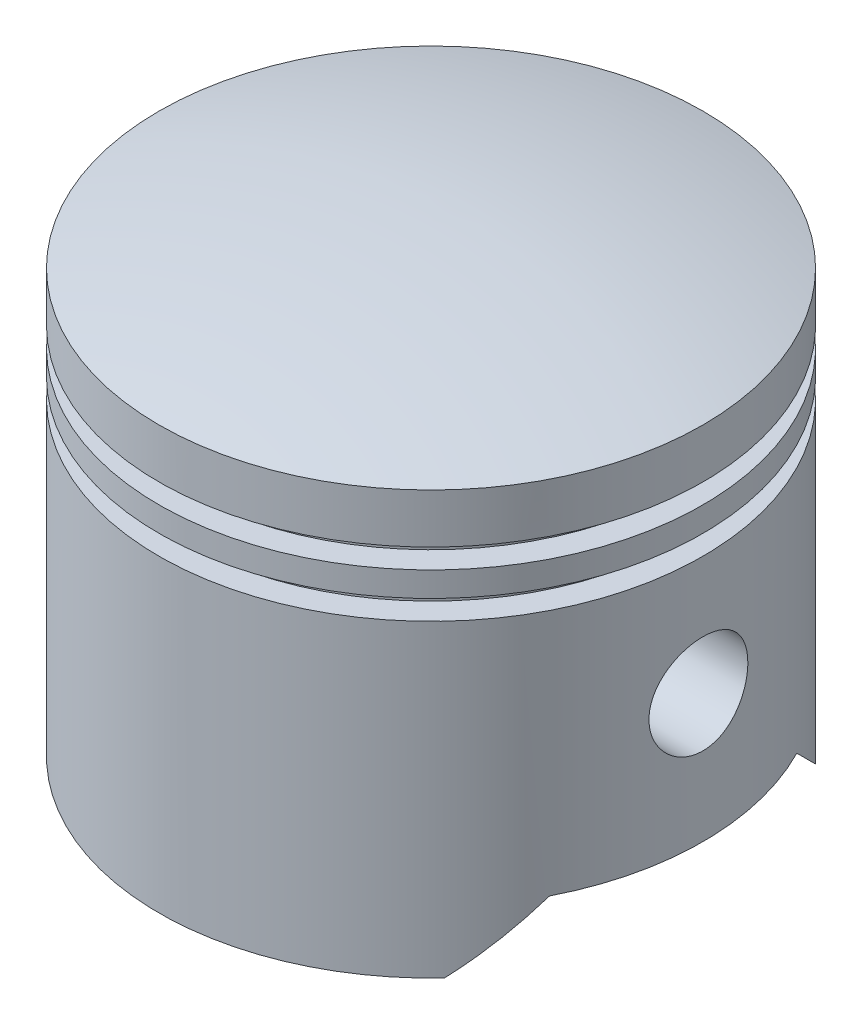
ISO-10303-21;
HEADER;
FILE_DESCRIPTION(('STEP AP214'),'2;1');
FILE_NAME('part.step','',(''),(''),'','','');
FILE_SCHEMA(('AUTOMOTIVE_DESIGN { 1 0 10303 214 1 1 1 1 }'));
ENDSEC;
DATA;
#1=APPLICATION_CONTEXT('core data for automotive mechanical design processes');
#2=APPLICATION_PROTOCOL_DEFINITION('international standard','automotive_design',2000,#1);
#3=PRODUCT_CONTEXT('',#1,'mechanical');
#4=PRODUCT('Part','Part','',(#3));
#5=PRODUCT_RELATED_PRODUCT_CATEGORY('part','',(#4));
#6=PRODUCT_DEFINITION_FORMATION('','',#4);
#7=PRODUCT_DEFINITION_CONTEXT('part definition',#1,'design');
#8=PRODUCT_DEFINITION('design','',#6,#7);
#9=PRODUCT_DEFINITION_SHAPE('','',#8);
#10=(LENGTH_UNIT() NAMED_UNIT(*) SI_UNIT(.MILLI.,.METRE.));
#11=(NAMED_UNIT(*) PLANE_ANGLE_UNIT() SI_UNIT($,.RADIAN.));
#12=(NAMED_UNIT(*) SI_UNIT($,.STERADIAN.) SOLID_ANGLE_UNIT());
#13=UNCERTAINTY_MEASURE_WITH_UNIT(LENGTH_MEASURE(1.E-05),#10,'distance_accuracy_value','');
#14=(GEOMETRIC_REPRESENTATION_CONTEXT(3) GLOBAL_UNCERTAINTY_ASSIGNED_CONTEXT((#13)) GLOBAL_UNIT_ASSIGNED_CONTEXT((#10,
#11,#12)) REPRESENTATION_CONTEXT('',''));
#15=CARTESIAN_POINT('',(0.,0.,0.));
#16=DIRECTION('',(0.,0.,1.));
#17=DIRECTION('',(1.,0.,0.));
#18=AXIS2_PLACEMENT_3D('',#15,#16,#17);
#19=CARTESIAN_POINT('',(-6.,-56.,0.));
#20=DIRECTION('',(1.,0.,0.));
#21=DIRECTION('',(0.,0.,-1.));
#22=AXIS2_PLACEMENT_3D('',#19,#20,#21);
#23=CYLINDRICAL_SURFACE('',#22,75.);
#24=CARTESIAN_POINT('',(6.,-56.,0.));
#25=DIRECTION('',(1.,0.,0.));
#26=DIRECTION('',(0.,0.,-1.));
#27=AXIS2_PLACEMENT_3D('',#24,#25,#26);
#28=CIRCLE('',#27,75.);
#29=CARTESIAN_POINT('',(6.,17.5187051028512,-14.8323969741913));
#30=VERTEX_POINT('',#29);
#31=CARTESIAN_POINT('',(6.,17.5187051028512,14.8323969741913));
#32=VERTEX_POINT('',#31);
#33=EDGE_CURVE('E185',#30,#32,#28,.T.);
#34=ORIENTED_EDGE('',*,*,#33,.T.);
#35=CARTESIAN_POINT('',(6.,17.5187051028512,14.8323969741913));
#36=CARTESIAN_POINT('',(5.75836252367393,17.4989829505454,14.9301433895327));
#37=CARTESIAN_POINT('',(5.51430721440014,17.48025079181,15.0219966371138));
#38=CARTESIAN_POINT('',(5.0218553343729,17.4449367059868,15.1937158110071));
#39=CARTESIAN_POINT('',(4.77345864664999,17.4283548369359,15.2735814137796));
#40=CARTESIAN_POINT('',(4.02268690858528,17.3821019778755,15.4948380198577));
#41=CARTESIAN_POINT('',(3.51456639013813,17.3559101926299,15.6179550759827));
#42=CARTESIAN_POINT('',(2.5073987594542,17.3146857646356,15.8103171965305));
#43=CARTESIAN_POINT('',(2.00871124649219,17.2992761877037,15.8813865039318));
#44=CARTESIAN_POINT('',(1.00668208650338,17.2786641618277,15.9762248796491));
#45=CARTESIAN_POINT('',(0.503341043251691,17.2734604068895,16.));
#46=CARTESIAN_POINT('',(-0.503341043251687,17.2734604068895,16.));
#47=CARTESIAN_POINT('',(-1.00668208650338,17.2786641618277,15.9762248796492));
#48=CARTESIAN_POINT('',(-2.00871124649219,17.2992761877037,15.8813865039318));
#49=CARTESIAN_POINT('',(-2.50739875945419,17.3146857646356,15.8103171965305));
#50=CARTESIAN_POINT('',(-3.51456639013813,17.3559101926299,15.6179550759827));
#51=CARTESIAN_POINT('',(-4.02268690858528,17.3821019778755,15.4948380198577));
#52=CARTESIAN_POINT('',(-4.77345864664999,17.4283548369359,15.2735814137796));
#53=CARTESIAN_POINT('',(-5.0218553343729,17.4449367059868,15.1937158110071));
#54=CARTESIAN_POINT('',(-5.51430721440014,17.4802507918099,15.0219966371138));
#55=CARTESIAN_POINT('',(-5.75836252367393,17.4989829505454,14.9301433895327));
#56=CARTESIAN_POINT('',(-6.,17.5187051028512,14.8323969741913));
#57=B_SPLINE_CURVE_WITH_KNOTS('',3,(#35,#36,#37,#38,#39,#40,#41,#42,#43,#44,#45,#46,#47,#48,#49,
#50,#51,#52,#53,#54,#55,#56),.UNSPECIFIED.,.F.,.F.,(4,2,2,2,2,2,2,2,2,2,4),(0.,0.78404449831372,
1.56811015374929,3.13571220008882,4.64532955159964,6.15475371140588,7.66417787121211,
9.17379522272293,10.7413972690625,11.525462924498,12.3095074228118),.UNSPECIFIED.);
#58=CARTESIAN_POINT('',(-6.,17.5187051028512,14.8323969741913));
#59=VERTEX_POINT('',#58);
#60=EDGE_CURVE('E177',#32,#59,#57,.T.);
#61=ORIENTED_EDGE('',*,*,#60,.T.);
#62=CARTESIAN_POINT('',(-6.,-56.,0.));
#63=DIRECTION('',(1.,0.,0.));
#64=DIRECTION('',(0.,0.,-1.));
#65=AXIS2_PLACEMENT_3D('',#62,#63,#64);
#66=CIRCLE('',#65,75.);
#67=CARTESIAN_POINT('',(-6.,17.5187051028512,-14.8323969741913));
#68=VERTEX_POINT('',#67);
#69=EDGE_CURVE('E184',#68,#59,#66,.T.);
#70=ORIENTED_EDGE('',*,*,#69,.F.);
#71=CARTESIAN_POINT('',(-6.,17.5187051028512,-14.8323969741913));
#72=CARTESIAN_POINT('',(-5.75836252367393,17.4989829505454,-14.9301433895327));
#73=CARTESIAN_POINT('',(-5.51430721440014,17.48025079181,-15.0219966371138));
#74=CARTESIAN_POINT('',(-5.0218553343729,17.4449367059868,-15.1937158110071));
#75=CARTESIAN_POINT('',(-4.77345864664999,17.4283548369359,-15.2735814137796));
#76=CARTESIAN_POINT('',(-4.02268690858528,17.3821019778755,-15.4948380198577));
#77=CARTESIAN_POINT('',(-3.51456639013813,17.3559101926299,-15.6179550759827));
#78=CARTESIAN_POINT('',(-2.50739875945419,17.3146857646356,-15.8103171965305));
#79=CARTESIAN_POINT('',(-2.00871124649219,17.2992761877037,-15.8813865039318));
#80=CARTESIAN_POINT('',(-1.00668208650338,17.2786641618277,-15.9762248796491));
#81=CARTESIAN_POINT('',(-0.503341043251689,17.2734604068895,-16.));
#82=CARTESIAN_POINT('',(0.50334104325169,17.2734604068895,-16.));
#83=CARTESIAN_POINT('',(1.00668208650338,17.2786641618277,-15.9762248796492));
#84=CARTESIAN_POINT('',(2.00871124649219,17.2992761877037,-15.8813865039318));
#85=CARTESIAN_POINT('',(2.50739875945419,17.3146857646356,-15.8103171965305));
#86=CARTESIAN_POINT('',(3.51456639013813,17.3559101926299,-15.6179550759827));
#87=CARTESIAN_POINT('',(4.02268690858528,17.3821019778755,-15.4948380198577));
#88=CARTESIAN_POINT('',(4.77345864664999,17.4283548369359,-15.2735814137796));
#89=CARTESIAN_POINT('',(5.0218553343729,17.4449367059868,-15.1937158110071));
#90=CARTESIAN_POINT('',(5.51430721440014,17.48025079181,-15.0219966371138));
#91=CARTESIAN_POINT('',(5.75836252367393,17.4989829505454,-14.9301433895327));
#92=CARTESIAN_POINT('',(6.,17.5187051028512,-14.8323969741913));
#93=B_SPLINE_CURVE_WITH_KNOTS('',3,(#71,#72,#73,#74,#75,#76,#77,#78,#79,#80,#81,#82,#83,#84,#85,
#86,#87,#88,#89,#90,#91,#92),.UNSPECIFIED.,.F.,.F.,(4,2,2,2,2,2,2,2,2,2,4),(0.,
0.784044498313721,1.56811015374929,3.13571220008882,4.64532955159965,6.15475371140588,
7.66417787121212,9.17379522272294,10.7413972690625,11.525462924498,12.3095074228118),.UNSPECIFIED.);
#94=EDGE_CURVE('E98',#68,#30,#93,.T.);
#95=ORIENTED_EDGE('',*,*,#94,.T.);
#96=EDGE_LOOP('',(#34,#61,#70,#95));
#97=FACE_BOUND('',#96,.T.);
#98=ADVANCED_FACE('F73',(#97),#23,.F.);
#99=CARTESIAN_POINT('',(6.,-56.,0.));
#100=DIRECTION('',(1.,0.,0.));
#101=DIRECTION('',(0.,0.,-1.));
#102=AXIS2_PLACEMENT_3D('',#99,#100,#101);
#103=PLANE('',#102);
#104=CARTESIAN_POINT('',(6.,0.,0.));
#105=DIRECTION('',(1.,0.,0.));
#106=DIRECTION('',(0.,0.,-1.));
#107=AXIS2_PLACEMENT_3D('',#104,#105,#106);
#108=CIRCLE('',#107,4.);
#109=CARTESIAN_POINT('',(6.,0.,-4.));
#110=VERTEX_POINT('',#109);
#111=EDGE_CURVE('E327',#110,#110,#108,.F.);
#112=ORIENTED_EDGE('',*,*,#111,.F.);
#113=EDGE_LOOP('',(#112));
#114=FACE_BOUND('',#113,.T.);
#115=DIRECTION('',(0.,-1.,0.));
#116=VECTOR('',#115,1.);
#117=CARTESIAN_POINT('',(6.,22.001,14.8323969741913));
#118=LINE('',#117,#116);
#119=CARTESIAN_POINT('',(6.,-10.3668522645212,14.8323969741913));
#120=VERTEX_POINT('',#119);
#121=EDGE_CURVE('E172',#32,#120,#118,.T.);
#122=ORIENTED_EDGE('',*,*,#121,.F.);
#123=ORIENTED_EDGE('',*,*,#33,.F.);
#124=DIRECTION('',(0.,-1.,0.));
#125=VECTOR('',#124,1.);
#126=CARTESIAN_POINT('',(6.,22.001,-14.8323969741913));
#127=LINE('',#126,#125);
#128=CARTESIAN_POINT('',(6.,-10.3668522645212,-14.8323969741913));
#129=VERTEX_POINT('',#128);
#130=EDGE_CURVE('E182',#30,#129,#127,.T.);
#131=ORIENTED_EDGE('',*,*,#130,.T.);
#132=DIRECTION('',(0.,0.,-1.));
#133=VECTOR('',#132,1.);
#134=CARTESIAN_POINT('',(6.,-10.3668522645212,16.));
#135=LINE('',#134,#133);
#136=EDGE_CURVE('E90',#120,#129,#135,.T.);
#137=ORIENTED_EDGE('',*,*,#136,.F.);
#138=EDGE_LOOP('',(#122,#123,#131,#137));
#139=FACE_BOUND('',#138,.T.);
#140=ADVANCED_FACE('F180',(#114,#139),#103,.F.);
#141=CARTESIAN_POINT('',(-6.,-56.,0.));
#142=DIRECTION('',(1.,0.,0.));
#143=DIRECTION('',(0.,0.,-1.));
#144=AXIS2_PLACEMENT_3D('',#141,#142,#143);
#145=PLANE('',#144);
#146=CARTESIAN_POINT('',(-6.,0.,0.));
#147=DIRECTION('',(1.,0.,0.));
#148=DIRECTION('',(0.,0.,-1.));
#149=AXIS2_PLACEMENT_3D('',#146,#147,#148);
#150=CIRCLE('',#149,4.);
#151=CARTESIAN_POINT('',(-6.,0.,-4.));
#152=VERTEX_POINT('',#151);
#153=EDGE_CURVE('E77',#152,#152,#150,.F.);
#154=ORIENTED_EDGE('',*,*,#153,.T.);
#155=EDGE_LOOP('',(#154));
#156=FACE_BOUND('',#155,.T.);
#157=ORIENTED_EDGE('',*,*,#69,.T.);
#158=DIRECTION('',(0.,-1.,0.));
#159=VECTOR('',#158,1.);
#160=CARTESIAN_POINT('',(-6.,22.001,14.8323969741913));
#161=LINE('',#160,#159);
#162=CARTESIAN_POINT('',(-6.,-10.3668522645212,14.8323969741913));
#163=VERTEX_POINT('',#162);
#164=EDGE_CURVE('E171',#59,#163,#161,.T.);
#165=ORIENTED_EDGE('',*,*,#164,.T.);
#166=DIRECTION('',(0.,0.,-1.));
#167=VECTOR('',#166,1.);
#168=CARTESIAN_POINT('',(-6.,-10.3668522645212,16.));
#169=LINE('',#168,#167);
#170=CARTESIAN_POINT('',(-6.,-10.3668522645212,-14.8323969741913));
#171=VERTEX_POINT('',#170);
#172=EDGE_CURVE('E168',#163,#171,#169,.T.);
#173=ORIENTED_EDGE('',*,*,#172,.T.);
#174=DIRECTION('',(0.,-1.,0.));
#175=VECTOR('',#174,1.);
#176=CARTESIAN_POINT('',(-6.,22.001,-14.8323969741913));
#177=LINE('',#176,#175);
#178=EDGE_CURVE('E484',#68,#171,#177,.T.);
#179=ORIENTED_EDGE('',*,*,#178,.F.);
#180=EDGE_LOOP('',(#157,#165,#173,#179));
#181=FACE_BOUND('',#180,.T.);
#182=ADVANCED_FACE('F295',(#156,#181),#145,.T.);
#183=CARTESIAN_POINT('',(-22.,-10.3668522645212,10.));
#184=DIRECTION('',(0.,-1.,0.));
#185=DIRECTION('',(0.,0.,-1.));
#186=AXIS2_PLACEMENT_3D('',#183,#184,#185);
#187=PLANE('',#186);
#188=ORIENTED_EDGE('',*,*,#172,.F.);
#189=CARTESIAN_POINT('',(0.,-10.3668522645212,0.));
#190=DIRECTION('',(0.,-1.,0.));
#191=DIRECTION('',(0.,0.,-1.));
#192=AXIS2_PLACEMENT_3D('',#189,#190,#191);
#193=CIRCLE('',#192,16.);
#194=EDGE_CURVE('E164',#120,#163,#193,.T.);
#195=ORIENTED_EDGE('',*,*,#194,.F.);
#196=ORIENTED_EDGE('',*,*,#136,.T.);
#197=CARTESIAN_POINT('',(0.,-10.3668522645212,0.));
#198=DIRECTION('',(0.,-1.,0.));
#199=DIRECTION('',(0.,0.,-1.));
#200=AXIS2_PLACEMENT_3D('',#197,#198,#199);
#201=CIRCLE('',#200,16.);
#202=EDGE_CURVE('E486',#171,#129,#201,.T.);
#203=ORIENTED_EDGE('',*,*,#202,.F.);
#204=EDGE_LOOP('',(#188,#195,#196,#203));
#205=FACE_BOUND('',#204,.T.);
#206=DIRECTION('',(1.,0.,0.));
#207=VECTOR('',#206,1.);
#208=CARTESIAN_POINT('',(-22.,-10.3668522645212,-10.));
#209=LINE('',#208,#207);
#210=CARTESIAN_POINT('',(-19.5959179422654,-10.3668522645212,-10.));
#211=VERTEX_POINT('',#210);
#212=CARTESIAN_POINT('',(-17.3205080756888,-10.3668522645212,-10.));
#213=VERTEX_POINT('',#212);
#214=EDGE_CURVE('E206',#211,#213,#209,.T.);
#215=ORIENTED_EDGE('',*,*,#214,.T.);
#216=CARTESIAN_POINT('',(0.,-10.3668522645212,0.));
#217=DIRECTION('',(0.,-1.,0.));
#218=DIRECTION('',(0.,0.,-1.));
#219=AXIS2_PLACEMENT_3D('',#216,#217,#218);
#220=CIRCLE('',#219,20.);
#221=CARTESIAN_POINT('',(17.3205080756888,-10.3668522645212,-10.));
#222=VERTEX_POINT('',#221);
#223=EDGE_CURVE('E194',#222,#213,#220,.F.);
#224=ORIENTED_EDGE('',*,*,#223,.F.);
#225=CARTESIAN_POINT('',(19.5959179422654,-10.3668522645212,-10.));
#226=VERTEX_POINT('',#225);
#227=EDGE_CURVE('E204',#222,#226,#209,.T.);
#228=ORIENTED_EDGE('',*,*,#227,.T.);
#229=CARTESIAN_POINT('',(0.,-10.3668522645212,0.));
#230=DIRECTION('',(0.,-1.,0.));
#231=DIRECTION('',(0.,0.,-1.));
#232=AXIS2_PLACEMENT_3D('',#229,#230,#231);
#233=CIRCLE('',#232,22.);
#234=CARTESIAN_POINT('',(19.5959179422654,-10.3668522645212,10.));
#235=VERTEX_POINT('',#234);
#236=EDGE_CURVE('E248',#235,#226,#233,.F.);
#237=ORIENTED_EDGE('',*,*,#236,.F.);
#238=DIRECTION('',(1.,0.,0.));
#239=VECTOR('',#238,1.);
#240=CARTESIAN_POINT('',(-22.,-10.3668522645212,10.));
#241=LINE('',#240,#239);
#242=CARTESIAN_POINT('',(17.3205080756888,-10.3668522645212,10.));
#243=VERTEX_POINT('',#242);
#244=EDGE_CURVE('E205',#243,#235,#241,.T.);
#245=ORIENTED_EDGE('',*,*,#244,.F.);
#246=CARTESIAN_POINT('',(-17.3205080756888,-10.3668522645212,10.));
#247=VERTEX_POINT('',#246);
#248=EDGE_CURVE('E197',#247,#243,#220,.F.);
#249=ORIENTED_EDGE('',*,*,#248,.F.);
#250=CARTESIAN_POINT('',(-19.5959179422654,-10.3668522645212,10.));
#251=VERTEX_POINT('',#250);
#252=EDGE_CURVE('E201',#251,#247,#241,.T.);
#253=ORIENTED_EDGE('',*,*,#252,.F.);
#254=EDGE_CURVE('E252',#211,#251,#233,.F.);
#255=ORIENTED_EDGE('',*,*,#254,.F.);
#256=EDGE_LOOP('',(#215,#224,#228,#237,#245,#249,#253,#255));
#257=FACE_BOUND('',#256,.T.);
#258=ADVANCED_FACE('F166',(#205,#257),#187,.T.);
#259=CARTESIAN_POINT('',(-22.,0.,0.));
#260=DIRECTION('',(1.,0.,0.));
#261=DIRECTION('',(0.,0.,-1.));
#262=AXIS2_PLACEMENT_3D('',#259,#260,#261);
#263=CYLINDRICAL_SURFACE('',#262,4.);
#264=CARTESIAN_POINT('',(-22.,-4.,0.));
#265=CARTESIAN_POINT('',(-21.9999960145572,-3.99999136267864,0.222714543288746));
#266=CARTESIAN_POINT('',(-21.9965830546687,-3.9813364850347,0.445542899836404));
#267=CARTESIAN_POINT('',(-21.9832969500399,-3.90725306795016,0.884928813696618));
#268=CARTESIAN_POINT('',(-21.9734182144508,-3.85179270283726,1.10148077453215));
#269=CARTESIAN_POINT('',(-21.9483064647013,-3.70584574065803,1.52189514502749));
#270=CARTESIAN_POINT('',(-21.9330781586384,-3.61538993562047,1.72576852786035));
#271=CARTESIAN_POINT('',(-21.898933429966,-3.40210533761642,2.115424006769));
#272=CARTESIAN_POINT('',(-21.8800173406264,-3.27927946962361,2.30120773535809));
#273=CARTESIAN_POINT('',(-21.8403486699966,-3.00326818071459,2.65152888102477));
#274=CARTESIAN_POINT('',(-21.8195794519416,-2.84978831603848,2.81583245206691));
#275=CARTESIAN_POINT('',(-21.7786699042361,-2.51745929182035,3.11650714682158));
#276=CARTESIAN_POINT('',(-21.7585296182252,-2.3386083766217,3.25287633589955));
#277=CARTESIAN_POINT('',(-21.7209968041953,-1.95897454108045,3.49477390032954));
#278=CARTESIAN_POINT('',(-21.703625742202,-1.75803892953925,3.60006626531112));
#279=CARTESIAN_POINT('',(-21.673831665538,-1.34096269935207,3.77531093899957));
#280=CARTESIAN_POINT('',(-21.6614082507349,-1.12482331194993,3.8452661056655));
#281=CARTESIAN_POINT('',(-21.6430830703341,-0.685970701286806,3.9471039542263));
#282=CARTESIAN_POINT('',(-21.6371116924469,-0.463354816580752,3.97939332850889));
#283=CARTESIAN_POINT('',(-21.6321566286462,-0.0157911853708658,4.00624497473377));
#284=CARTESIAN_POINT('',(-21.633172353881,0.209156363032061,4.00081042593285));
#285=CARTESIAN_POINT('',(-21.6420133009836,0.652063828266034,3.95269868854));
#286=CARTESIAN_POINT('',(-21.6497542562852,0.870075735791442,3.91048235398144));
#287=CARTESIAN_POINT('',(-21.6710412254782,1.29587003673433,3.79073046680053));
#288=CARTESIAN_POINT('',(-21.6845874726463,1.50365201870358,3.71319349486376));
#289=CARTESIAN_POINT('',(-21.7160476310543,1.90444558155747,3.52454595578591));
#290=CARTESIAN_POINT('',(-21.733985834287,2.09736688533225,3.41324780743079));
#291=CARTESIAN_POINT('',(-21.7721924402343,2.46196947389059,3.16037006748086));
#292=CARTESIAN_POINT('',(-21.7924610656694,2.63364872529248,3.01878758047169));
#293=CARTESIAN_POINT('',(-21.8334128161709,2.95355799288874,2.70686798836705));
#294=CARTESIAN_POINT('',(-21.8540976363293,3.10140337687383,2.53613634531379));
#295=CARTESIAN_POINT('',(-21.8932750087417,3.36641026696166,2.17208908138662));
#296=CARTESIAN_POINT('',(-21.9117675414312,3.48357149924253,1.97877325899631));
#297=CARTESIAN_POINT('',(-21.9445107565068,3.68393477957005,1.57465519699459));
#298=CARTESIAN_POINT('',(-21.9587566511844,3.76709853739196,1.36383356079098));
#299=CARTESIAN_POINT('',(-21.9813641094176,3.89672638498741,0.930896828925332));
#300=CARTESIAN_POINT('',(-21.9897262601819,3.94319413714782,0.708782862632129));
#301=CARTESIAN_POINT('',(-21.9995438675732,3.99757952383824,0.262877299156997));
#302=CARTESIAN_POINT('',(-22.0010937868229,4.00602444690816,0.0391520242178673));
#303=CARTESIAN_POINT('',(-21.99737260495,3.98553640363702,-0.406514477941935));
#304=CARTESIAN_POINT('',(-21.9921018181742,3.95660515985652,-0.628455786906163));
#305=CARTESIAN_POINT('',(-21.975390172649,3.86262450087624,-1.06259419518551));
#306=CARTESIAN_POINT('',(-21.9639946314432,3.79784026163435,-1.27485059491663));
#307=CARTESIAN_POINT('',(-21.9363059024444,3.63427834295612,-1.68548942751322));
#308=CARTESIAN_POINT('',(-21.9200123978487,3.5354984646046,-1.8838709619219));
#309=CARTESIAN_POINT('',(-21.8840995916968,3.30557072439415,-2.26339049414987));
#310=CARTESIAN_POINT('',(-21.864447632292,3.17409862568815,-2.44432890416976));
#311=CARTESIAN_POINT('',(-21.8240857614217,2.88295924665781,-2.78176427644694));
#312=CARTESIAN_POINT('',(-21.8033757575701,2.72328950117612,-2.93825909948664));
#313=CARTESIAN_POINT('',(-21.7629207911529,2.37790623710301,-3.22435475775359));
#314=CARTESIAN_POINT('',(-21.7431910424377,2.19189338694827,-3.35359673482837));
#315=CARTESIAN_POINT('',(-21.7072302016204,1.80048763718703,-3.57899973104027));
#316=CARTESIAN_POINT('',(-21.6909989844708,1.59509543063123,-3.6751619326159));
#317=CARTESIAN_POINT('',(-21.6639908923095,1.17169850061651,-3.83115890483493));
#318=CARTESIAN_POINT('',(-21.6531887603349,0.95375753852389,-3.8911621572368));
#319=CARTESIAN_POINT('',(-21.6382025309078,0.510674022737862,-3.97366080357107));
#320=CARTESIAN_POINT('',(-21.6340177362272,0.285532230302156,-3.99616014907258));
#321=CARTESIAN_POINT('',(-21.6327738776523,-0.161970750927271,-4.00288627326368));
#322=CARTESIAN_POINT('',(-21.6356094908823,-0.384323342877081,-3.98767874002465));
#323=CARTESIAN_POINT('',(-21.6478541749405,-0.823247276034826,-3.92065693825629));
#324=CARTESIAN_POINT('',(-21.6572632119402,-1.03981864698857,-3.86884285811435));
#325=CARTESIAN_POINT('',(-21.6815514416183,-1.46075239479074,-3.73031134316953));
#326=CARTESIAN_POINT('',(-21.6964215859949,-1.66513432044686,-3.64365162038464));
#327=CARTESIAN_POINT('',(-21.7299635502969,-2.05654889432947,-3.43794947329646));
#328=CARTESIAN_POINT('',(-21.7486356164588,-2.24358041769117,-3.31890495138014));
#329=CARTESIAN_POINT('',(-21.7880064930293,-2.59782574919125,-3.04983087325598));
#330=CARTESIAN_POINT('',(-21.8087301566221,-2.76472313974153,-2.89938831106199));
#331=CARTESIAN_POINT('',(-21.849679841373,-3.07109416202438,-2.57265302846728));
#332=CARTESIAN_POINT('',(-21.8699057470383,-3.21056148078449,-2.39635437360186));
#333=CARTESIAN_POINT('',(-21.9077794859438,-3.45920059424698,-2.0211423792926));
#334=CARTESIAN_POINT('',(-21.9254042634686,-3.56810837036026,-1.82205169958099));
#335=CARTESIAN_POINT('',(-21.9558652198669,-3.75075843214811,-1.40814781017269));
#336=CARTESIAN_POINT('',(-21.9687059716947,-3.82453431855663,-1.19334985097334));
#337=CARTESIAN_POINT('',(-21.9854814075298,-3.91955086060438,-0.814883498916811));
#338=CARTESIAN_POINT('',(-21.9908956054717,-3.9496686659207,-0.65345085455298));
#339=CARTESIAN_POINT('',(-21.9981563286609,-3.9898961875898,-0.328032684264407));
#340=CARTESIAN_POINT('',(-22.0000029356,-4.00000636208354,-0.164047216881666));
#341=CARTESIAN_POINT('',(-22.,-4.,0.));
#342=B_SPLINE_CURVE_WITH_KNOTS('',3,(#264,#265,#266,#267,#268,#269,#270,#271,#272,#273,#274,
#275,#276,#277,#278,#279,#280,#281,#282,#283,#284,#285,#286,#287,#288,#289,#290,#291,#292,#293,
#294,#295,#296,#297,#298,#299,#300,#301,#302,#303,#304,#305,#306,#307,#308,#309,#310,#311,#312,
#313,#314,#315,#316,#317,#318,#319,#320,#321,#322,#323,#324,#325,#326,#327,#328,#329,#330,#331,
#332,#333,#334,#335,#336,#337,#338,#339,#340,#341),.UNSPECIFIED.,.T.,.F.,(4,2,2,2,2,2,2,2,2,2,2,
2,2,2,2,2,2,2,2,2,2,2,2,2,2,2,2,2,2,2,2,2,2,2,2,2,2,2,4),(0.,0.667543783104664,1.33566554414518,
2.00320076573349,2.670675689203,3.3449002919377,4.01917157326156,4.698439044073,5.3776515691146,
6.0494604234529,6.72121266048404,7.3846673458179,8.04814869357741,8.7153861292325,
9.38268738642509,10.0598642088374,10.7370470740929,11.4149905404762,12.0928663372291,
12.7613120199473,13.4297268970159,14.0932628657086,14.7568417614844,15.4272845359133,
16.0977859523225,16.7766301226092,17.4554500250495,18.1310820215231,18.806642826072,
19.4721301946074,20.1376141383862,20.8020004051792,21.4664297155381,22.1402222906008,
22.8141697565893,23.4937720908585,24.1727231299633,24.6644342045912,25.1561340197353),.UNSPECIFIED.);
#343=CARTESIAN_POINT('',(-22.,-4.,0.));
#344=VERTEX_POINT('',#343);
#345=EDGE_CURVE('E268',#344,#344,#342,.T.);
#346=ORIENTED_EDGE('',*,*,#345,.T.);
#347=EDGE_LOOP('',(#346));
#348=FACE_BOUND('',#347,.T.);
#349=ORIENTED_EDGE('',*,*,#153,.F.);
#350=EDGE_LOOP('',(#349));
#351=FACE_BOUND('',#350,.T.);
#352=ADVANCED_FACE('F284',(#348,#351),#263,.F.);
#353=CARTESIAN_POINT('',(-22.,-15.3668522645212,15.));
#354=DIRECTION('',(0.,-0.707106781186546,-0.707106781186549));
#355=DIRECTION('',(0.,0.707106781186549,-0.707106781186546));
#356=AXIS2_PLACEMENT_3D('',#353,#354,#355);
#357=PLANE('',#356);
#358=CARTESIAN_POINT('',(0.,-0.366852264521135,0.));
#359=DIRECTION('',(0.,-0.707106781186546,-0.707106781186549));
#360=DIRECTION('',(0.,-0.707106781186549,0.707106781186546));
#361=AXIS2_PLACEMENT_3D('',#358,#359,#360);
#362=ELLIPSE('',#361,28.284271247462,20.);
#363=CARTESIAN_POINT('',(-13.228756555323,-15.3668522645212,15.));
#364=VERTEX_POINT('',#363);
#365=EDGE_CURVE('E200',#364,#247,#362,.T.);
#366=ORIENTED_EDGE('',*,*,#365,.F.);
#367=DIRECTION('',(1.,0.,0.));
#368=VECTOR('',#367,1.);
#369=CARTESIAN_POINT('',(-22.,-15.3668522645212,15.));
#370=LINE('',#369,#368);
#371=CARTESIAN_POINT('',(-16.0934769394311,-15.3668522645212,15.));
#372=VERTEX_POINT('',#371);
#373=EDGE_CURVE('E214',#372,#364,#370,.T.);
#374=ORIENTED_EDGE('',*,*,#373,.F.);
#375=CARTESIAN_POINT('',(0.,-0.366852264521125,0.));
#376=DIRECTION('',(0.,-0.707106781186546,-0.707106781186549));
#377=DIRECTION('',(0.,0.707106781186549,-0.707106781186546));
#378=AXIS2_PLACEMENT_3D('',#375,#376,#377);
#379=ELLIPSE('',#378,31.1126983722082,22.);
#380=EDGE_CURVE('E256',#251,#372,#379,.F.);
#381=ORIENTED_EDGE('',*,*,#380,.F.);
#382=ORIENTED_EDGE('',*,*,#252,.T.);
#383=EDGE_LOOP('',(#366,#374,#381,#382));
#384=FACE_BOUND('',#383,.T.);
#385=ADVANCED_FACE('F293',(#384),#357,.T.);
#386=CARTESIAN_POINT('',(-22.,-15.3668522645212,-15.));
#387=DIRECTION('',(0.,0.707106781186546,-0.707106781186549));
#388=DIRECTION('',(0.,0.707106781186549,0.707106781186546));
#389=AXIS2_PLACEMENT_3D('',#386,#387,#388);
#390=PLANE('',#389);
#391=DIRECTION('',(1.,0.,0.));
#392=VECTOR('',#391,1.);
#393=CARTESIAN_POINT('',(-22.,-15.3668522645212,-15.));
#394=LINE('',#393,#392);
#395=CARTESIAN_POINT('',(-16.0934769394311,-15.3668522645212,-15.));
#396=VERTEX_POINT('',#395);
#397=CARTESIAN_POINT('',(-13.228756555323,-15.3668522645212,-15.));
#398=VERTEX_POINT('',#397);
#399=EDGE_CURVE('E210',#396,#398,#394,.T.);
#400=ORIENTED_EDGE('',*,*,#399,.T.);
#401=CARTESIAN_POINT('',(0.,-0.366852264521135,0.));
#402=DIRECTION('',(0.,0.707106781186546,-0.707106781186549));
#403=DIRECTION('',(0.,-0.707106781186549,-0.707106781186546));
#404=AXIS2_PLACEMENT_3D('',#401,#402,#403);
#405=ELLIPSE('',#404,28.284271247462,20.);
#406=EDGE_CURVE('E12',#398,#213,#405,.T.);
#407=ORIENTED_EDGE('',*,*,#406,.T.);
#408=ORIENTED_EDGE('',*,*,#214,.F.);
#409=CARTESIAN_POINT('',(0.,-0.366852264521125,0.));
#410=DIRECTION('',(0.,0.707106781186546,-0.707106781186549));
#411=DIRECTION('',(0.,0.707106781186549,0.707106781186546));
#412=AXIS2_PLACEMENT_3D('',#409,#410,#411);
#413=ELLIPSE('',#412,31.1126983722082,22.);
#414=EDGE_CURVE('E255',#211,#396,#413,.F.);
#415=ORIENTED_EDGE('',*,*,#414,.T.);
#416=EDGE_LOOP('',(#400,#407,#408,#415));
#417=FACE_BOUND('',#416,.T.);
#418=ADVANCED_FACE('F298',(#417),#390,.F.);
#419=CARTESIAN_POINT('',(-22.,-15.3668522645212,0.));
#420=DIRECTION('',(0.,-1.,0.));
#421=DIRECTION('',(1.,0.,0.));
#422=AXIS2_PLACEMENT_3D('',#419,#420,#421);
#423=PLANE('',#422);
#424=CARTESIAN_POINT('',(0.,-15.3668522645212,0.));
#425=DIRECTION('',(0.,-1.,0.));
#426=DIRECTION('',(1.,0.,0.));
#427=AXIS2_PLACEMENT_3D('',#424,#425,#426);
#428=CIRCLE('',#427,20.);
#429=CARTESIAN_POINT('',(13.228756555323,-15.3668522645212,15.));
#430=VERTEX_POINT('',#429);
#431=EDGE_CURVE('E192',#430,#364,#428,.T.);
#432=ORIENTED_EDGE('',*,*,#431,.F.);
#433=CARTESIAN_POINT('',(16.0934769394311,-15.3668522645212,15.));
#434=VERTEX_POINT('',#433);
#435=EDGE_CURVE('E213',#430,#434,#370,.T.);
#436=ORIENTED_EDGE('',*,*,#435,.T.);
#437=CARTESIAN_POINT('',(0.,-15.3668522645212,0.));
#438=DIRECTION('',(0.,1.,0.));
#439=DIRECTION('',(-1.,0.,0.));
#440=AXIS2_PLACEMENT_3D('',#437,#438,#439);
#441=CIRCLE('',#440,22.);
#442=EDGE_CURVE('E223',#372,#434,#441,.T.);
#443=ORIENTED_EDGE('',*,*,#442,.F.);
#444=ORIENTED_EDGE('',*,*,#373,.T.);
#445=EDGE_LOOP('',(#432,#436,#443,#444));
#446=FACE_BOUND('',#445,.T.);
#447=ADVANCED_FACE('F303',(#446),#423,.T.);
#448=CARTESIAN_POINT('',(0.,22.,0.));
#449=DIRECTION('',(0.,1.,0.));
#450=DIRECTION('',(-1.,0.,0.));
#451=AXIS2_PLACEMENT_3D('',#448,#449,#450);
#452=CYLINDRICAL_SURFACE('',#451,22.);
#453=ORIENTED_EDGE('',*,*,#345,.F.);
#454=EDGE_LOOP('',(#453));
#455=FACE_BOUND('',#454,.T.);
#456=CARTESIAN_POINT('',(21.6333076527839,0.,-4.));
#457=CARTESIAN_POINT('',(21.6333118939645,0.22268024514592,-3.99999133497668));
#458=CARTESIAN_POINT('',(21.636783172832,0.445474382576009,-3.98134200846101));
#459=CARTESIAN_POINT('',(21.650277261808,0.884789231745938,-3.907282639324));
#460=CARTESIAN_POINT('',(21.6603057667963,1.10130431933857,-3.85184064204138));
#461=CARTESIAN_POINT('',(21.6857418061113,1.52164062603702,-3.70594738579437));
#462=CARTESIAN_POINT('',(21.7011444752348,1.7254731306161,-3.61552778385548));
#463=CARTESIAN_POINT('',(21.7355875966023,2.11505978325792,-3.40232850816631));
#464=CARTESIAN_POINT('',(21.7546277295314,2.30081551603275,-3.27955167453961));
#465=CARTESIAN_POINT('',(21.7944494758657,2.65116689488351,-3.00359049647932));
#466=CARTESIAN_POINT('',(21.8152472612912,2.81552014846791,-2.85010070695621));
#467=CARTESIAN_POINT('',(21.8560978635286,3.11629112566885,-2.51773079268323));
#468=CARTESIAN_POINT('',(21.8761506327525,3.25270706729076,-2.338849049527));
#469=CARTESIAN_POINT('',(21.9134244798488,3.49465463690047,-1.95918683799973));
#470=CARTESIAN_POINT('',(21.930624292806,3.59995853999161,-1.75825898095977));
#471=CARTESIAN_POINT('',(21.9600735467303,3.77522666605229,-1.34119954887522));
#472=CARTESIAN_POINT('',(21.9723233703801,3.84519362101874,-1.12506915065336));
#473=CARTESIAN_POINT('',(21.9903782117666,3.94705446651091,-0.686249675641717));
#474=CARTESIAN_POINT('',(21.9962522909049,3.97935662864144,-0.463658257037537));
#475=CARTESIAN_POINT('',(22.0011316177893,4.0062423349248,-0.01614294593185));
#476=CARTESIAN_POINT('',(22.0001374169679,4.00082890714308,0.208780757870076));
#477=CARTESIAN_POINT('',(21.9914463710423,3.95275171584416,0.65177839228148));
#478=CARTESIAN_POINT('',(21.9838286175382,3.91052749297112,0.869901800106699));
#479=CARTESIAN_POINT('',(21.9628349381595,3.79072160507699,1.29591498120673));
#480=CARTESIAN_POINT('',(21.949458811838,3.71313870922753,1.50380439795921));
#481=CARTESIAN_POINT('',(21.9183184074471,3.52439388044169,1.90473245090769));
#482=CARTESIAN_POINT('',(21.9005310604676,3.41305471193232,2.09768578503493));
#483=CARTESIAN_POINT('',(21.8625379364345,3.16008822015063,2.46233526714585));
#484=CARTESIAN_POINT('',(21.8423319276856,3.01845799412901,2.63402937539644));
#485=CARTESIAN_POINT('',(21.8013981618568,2.70650309084144,2.95388890108789));
#486=CARTESIAN_POINT('',(21.7806670830423,2.53579396416202,3.10167918809898));
#487=CARTESIAN_POINT('',(21.7412992413716,2.17181187215816,3.36658543928332));
#488=CARTESIAN_POINT('',(21.7226625056581,1.97853861446948,3.48370100593934));
#489=CARTESIAN_POINT('',(21.6895894681967,1.57443497902635,3.68403076498185));
#490=CARTESIAN_POINT('',(21.6751596002547,1.36357833672042,3.76719310770445));
#491=CARTESIAN_POINT('',(21.6522346695387,0.930565100223263,3.89680753773996));
#492=CARTESIAN_POINT('',(21.6437389774287,0.708409706977712,3.94326351793351));
#493=CARTESIAN_POINT('',(21.6337680818549,0.262480397589181,3.99760435703092));
#494=CARTESIAN_POINT('',(21.6321950076556,0.0387741346607278,4.00602696978329));
#495=CARTESIAN_POINT('',(21.6359859030778,-0.406849101122151,3.98550109557699));
#496=CARTESIAN_POINT('',(21.6413495511773,-0.628766156427925,3.95655434071577));
#497=CARTESIAN_POINT('',(21.6583185875735,-1.06276068810456,3.86257219277794));
#498=CARTESIAN_POINT('',(21.6698756001577,-1.27490076801606,3.79781637710752));
#499=CARTESIAN_POINT('',(21.6978878160151,-1.68531943765688,3.63434995143755));
#500=CARTESIAN_POINT('',(21.7143433613546,-1.88359705817135,3.53563697012216));
#501=CARTESIAN_POINT('',(21.7505226830533,-2.26303839203049,3.30581172375987));
#502=CARTESIAN_POINT('',(21.7702800968595,-2.44399223616877,3.17435835883133));
#503=CARTESIAN_POINT('',(21.8107413258404,-2.78146738319551,2.88324609901472));
#504=CARTESIAN_POINT('',(21.8314452207001,-2.93798662399931,2.72358482602649));
#505=CARTESIAN_POINT('',(21.8717797209063,-3.22414569229957,2.37819260014522));
#506=CARTESIAN_POINT('',(21.8913936565351,-3.35342471072361,2.19216046504753));
#507=CARTESIAN_POINT('',(21.9270616275553,-3.57889261216599,1.80070523958705));
#508=CARTESIAN_POINT('',(21.9431157941211,-3.67508271455434,1.59528286413569));
#509=CARTESIAN_POINT('',(21.9697834526315,-3.83109607727288,1.17189643669069));
#510=CARTESIAN_POINT('',(21.9804239020959,-3.89109980975306,0.954000658707902));
#511=CARTESIAN_POINT('',(21.9951799495619,-3.97361468659431,0.51101329792696));
#512=CARTESIAN_POINT('',(21.9992961913554,-3.99612953027341,0.285922427358462));
#513=CARTESIAN_POINT('',(22.0005282842776,-4.00290504221103,-0.161599238057635));
#514=CARTESIAN_POINT('',(21.9977440646224,-3.98771177696937,-0.384021675850896));
#515=CARTESIAN_POINT('',(21.9856946780428,-3.92069410715213,-0.823089077981734));
#516=CARTESIAN_POINT('',(21.9764295654387,-3.86887000960198,-1.03973409072766));
#517=CARTESIAN_POINT('',(21.9524581381546,-3.73028619302147,-1.46083086688086));
#518=CARTESIAN_POINT('',(21.9377603669599,-3.64358130924888,-1.6653011932924));
#519=CARTESIAN_POINT('',(21.9045184478405,-3.43776119438248,-2.05687402388434));
#520=CARTESIAN_POINT('',(21.8859740630709,-3.31864396744516,-2.24397545759469));
#521=CARTESIAN_POINT('',(21.8467718041458,-3.04948472287622,-2.59822919507097));
#522=CARTESIAN_POINT('',(21.826088758947,-2.89904660923133,-2.76507779716897));
#523=CARTESIAN_POINT('',(21.7851034058444,-2.57234096661293,-3.07135244710172));
#524=CARTESIAN_POINT('',(21.7648011884524,-2.39606738287678,-3.21077204872679));
#525=CARTESIAN_POINT('',(21.7266856567864,-2.02088064879777,-3.45935343607217));
#526=CARTESIAN_POINT('',(21.7088952940926,-1.8217855213773,-3.56824417003713));
#527=CARTESIAN_POINT('',(21.6780923491353,-1.40787344654803,-3.75086117813966));
#528=CARTESIAN_POINT('',(21.6650751844592,-1.19307181678437,-3.82462119925559));
#529=CARTESIAN_POINT('',(21.6480562150115,-0.814646631135489,-3.91959792411038));
#530=CARTESIAN_POINT('',(21.642557744208,-0.65326147478277,-3.94969798379532));
#531=CARTESIAN_POINT('',(21.6351819455147,-0.327938095935634,-3.98990196850047));
#532=CARTESIAN_POINT('',(21.6333045292319,-0.163999935860683,-4.00000638163151));
#533=CARTESIAN_POINT('',(21.6333076527839,0.,-4.));
#534=B_SPLINE_CURVE_WITH_KNOTS('',3,(#456,#457,#458,#459,#460,#461,#462,#463,#464,#465,#466,
#467,#468,#469,#470,#471,#472,#473,#474,#475,#476,#477,#478,#479,#480,#481,#482,#483,#484,#485,
#486,#487,#488,#489,#490,#491,#492,#493,#494,#495,#496,#497,#498,#499,#500,#501,#502,#503,#504,
#505,#506,#507,#508,#509,#510,#511,#512,#513,#514,#515,#516,#517,#518,#519,#520,#521,#522,#523,
#524,#525,#526,#527,#528,#529,#530,#531,#532,#533),.UNSPECIFIED.,.T.,.F.,(4,2,2,2,2,2,2,2,2,2,2,
2,2,2,2,2,2,2,2,2,2,2,2,2,2,2,2,2,2,2,2,2,2,2,2,2,2,2,4),(0.,0.667440705257541,1.33546184685072,
2.00287979476302,2.67023918023371,3.3445987023052,4.01900122532956,4.69822425023956,
5.37739475450279,6.04913278831927,6.7208168910346,7.38458890585933,8.04838402822076,
8.71572656975959,9.38313309046882,10.0601670169629,10.7372097167831,11.4152824897346,
12.0932833402558,12.7616672929396,13.4300202666519,14.0932273132435,14.7564806826868,
15.4269564046825,16.0974886789026,16.7764104513919,17.4553072020415,18.1307894735074,
18.8062050859725,19.4718969577386,20.1375832499996,20.8022270968082,21.4669118794232,
22.1405775941432,22.8144014413677,23.4940309659146,24.1730063069362,24.6645762030324,
25.1561340993393),.UNSPECIFIED.);
#535=CARTESIAN_POINT('',(21.6333076527839,0.,-4.));
#536=VERTEX_POINT('',#535);
#537=EDGE_CURVE('E260',#536,#536,#534,.T.);
#538=ORIENTED_EDGE('',*,*,#537,.F.);
#539=EDGE_LOOP('',(#538));
#540=FACE_BOUND('',#539,.T.);
#541=CARTESIAN_POINT('',(0.,9.63314773547883,0.));
#542=DIRECTION('',(0.,1.,0.));
#543=DIRECTION('',(-1.,0.,0.));
#544=AXIS2_PLACEMENT_3D('',#541,#542,#543);
#545=CIRCLE('',#544,22.);
#546=CARTESIAN_POINT('',(-22.,9.63314773547883,0.));
#547=VERTEX_POINT('',#546);
#548=EDGE_CURVE('E217',#547,#547,#545,.T.);
#549=ORIENTED_EDGE('',*,*,#548,.F.);
#550=EDGE_LOOP('',(#549));
#551=FACE_BOUND('',#550,.T.);
#552=ORIENTED_EDGE('',*,*,#442,.T.);
#553=EDGE_CURVE('E259',#434,#235,#379,.F.);
#554=ORIENTED_EDGE('',*,*,#553,.T.);
#555=ORIENTED_EDGE('',*,*,#236,.T.);
#556=CARTESIAN_POINT('',(16.0934769394311,-15.3668522645212,-15.));
#557=VERTEX_POINT('',#556);
#558=EDGE_CURVE('E251',#557,#226,#413,.F.);
#559=ORIENTED_EDGE('',*,*,#558,.F.);
#560=EDGE_CURVE('E220',#557,#396,#441,.T.);
#561=ORIENTED_EDGE('',*,*,#560,.T.);
#562=ORIENTED_EDGE('',*,*,#414,.F.);
#563=ORIENTED_EDGE('',*,*,#254,.T.);
#564=ORIENTED_EDGE('',*,*,#380,.T.);
#565=EDGE_LOOP('',(#552,#554,#555,#559,#561,#562,#563,#564));
#566=FACE_BOUND('',#565,.T.);
#567=ADVANCED_FACE('F272',(#455,#540,#551,#566),#452,.T.);
#568=CARTESIAN_POINT('',(-22.,9.63314773547883,0.));
#569=DIRECTION('',(0.,1.,0.));
#570=DIRECTION('',(-1.,0.,0.));
#571=AXIS2_PLACEMENT_3D('',#568,#569,#570);
#572=PLANE('',#571);
#573=ORIENTED_EDGE('',*,*,#548,.T.);
#574=EDGE_LOOP('',(#573));
#575=FACE_BOUND('',#574,.T.);
#576=CARTESIAN_POINT('',(0.,9.63314773547883,0.));
#577=DIRECTION('',(0.,1.,0.));
#578=DIRECTION('',(-1.,0.,0.));
#579=AXIS2_PLACEMENT_3D('',#576,#577,#578);
#580=CIRCLE('',#579,20.);
#581=CARTESIAN_POINT('',(-20.,9.63314773547883,0.));
#582=VERTEX_POINT('',#581);
#583=EDGE_CURVE('E245',#582,#582,#580,.T.);
#584=ORIENTED_EDGE('',*,*,#583,.F.);
#585=EDGE_LOOP('',(#584));
#586=FACE_BOUND('',#585,.T.);
#587=ADVANCED_FACE('F75',(#575,#586),#572,.T.);
#588=CARTESIAN_POINT('',(0.,22.,0.));
#589=DIRECTION('',(0.,1.,0.));
#590=DIRECTION('',(-1.,0.,0.));
#591=AXIS2_PLACEMENT_3D('',#588,#589,#590);
#592=CYLINDRICAL_SURFACE('',#591,20.);
#593=ORIENTED_EDGE('',*,*,#583,.T.);
#594=EDGE_LOOP('',(#593));
#595=FACE_BOUND('',#594,.T.);
#596=CARTESIAN_POINT('',(0.,11.2331477354788,0.));
#597=DIRECTION('',(0.,1.,0.));
#598=DIRECTION('',(-1.,0.,0.));
#599=AXIS2_PLACEMENT_3D('',#596,#597,#598);
#600=CIRCLE('',#599,20.);
#601=CARTESIAN_POINT('',(-20.,11.2331477354788,0.));
#602=VERTEX_POINT('',#601);
#603=EDGE_CURVE('E242',#602,#602,#600,.T.);
#604=ORIENTED_EDGE('',*,*,#603,.F.);
#605=EDGE_LOOP('',(#604));
#606=FACE_BOUND('',#605,.T.);
#607=ADVANCED_FACE('F518',(#595,#606),#592,.T.);
#608=CARTESIAN_POINT('',(-20.,11.2331477354788,0.));
#609=DIRECTION('',(0.,-1.,0.));
#610=DIRECTION('',(1.,0.,0.));
#611=AXIS2_PLACEMENT_3D('',#608,#609,#610);
#612=PLANE('',#611);
#613=ORIENTED_EDGE('',*,*,#603,.T.);
#614=EDGE_LOOP('',(#613));
#615=FACE_BOUND('',#614,.T.);
#616=CARTESIAN_POINT('',(0.,11.2331477354788,0.));
#617=DIRECTION('',(0.,1.,0.));
#618=DIRECTION('',(-1.,0.,0.));
#619=AXIS2_PLACEMENT_3D('',#616,#617,#618);
#620=CIRCLE('',#619,22.);
#621=CARTESIAN_POINT('',(-22.,11.2331477354788,0.));
#622=VERTEX_POINT('',#621);
#623=EDGE_CURVE('E239',#622,#622,#620,.T.);
#624=ORIENTED_EDGE('',*,*,#623,.F.);
#625=EDGE_LOOP('',(#624));
#626=FACE_BOUND('',#625,.T.);
#627=ADVANCED_FACE('F525',(#615,#626),#612,.T.);
#628=CARTESIAN_POINT('',(0.,22.,0.));
#629=DIRECTION('',(0.,1.,0.));
#630=DIRECTION('',(-1.,0.,0.));
#631=AXIS2_PLACEMENT_3D('',#628,#629,#630);
#632=CYLINDRICAL_SURFACE('',#631,22.);
#633=ORIENTED_EDGE('',*,*,#623,.T.);
#634=EDGE_LOOP('',(#633));
#635=FACE_BOUND('',#634,.T.);
#636=CARTESIAN_POINT('',(0.,13.2331477354788,0.));
#637=DIRECTION('',(0.,1.,0.));
#638=DIRECTION('',(-1.,0.,0.));
#639=AXIS2_PLACEMENT_3D('',#636,#637,#638);
#640=CIRCLE('',#639,22.);
#641=CARTESIAN_POINT('',(-22.,13.2331477354788,0.));
#642=VERTEX_POINT('',#641);
#643=EDGE_CURVE('E236',#642,#642,#640,.T.);
#644=ORIENTED_EDGE('',*,*,#643,.F.);
#645=EDGE_LOOP('',(#644));
#646=FACE_BOUND('',#645,.T.);
#647=ADVANCED_FACE('F532',(#635,#646),#632,.T.);
#648=CARTESIAN_POINT('',(-22.,13.2331477354788,0.));
#649=DIRECTION('',(0.,1.,0.));
#650=DIRECTION('',(-1.,0.,0.));
#651=AXIS2_PLACEMENT_3D('',#648,#649,#650);
#652=PLANE('',#651);
#653=ORIENTED_EDGE('',*,*,#643,.T.);
#654=EDGE_LOOP('',(#653));
#655=FACE_BOUND('',#654,.T.);
#656=CARTESIAN_POINT('',(0.,13.2331477354788,0.));
#657=DIRECTION('',(0.,1.,0.));
#658=DIRECTION('',(-1.,0.,0.));
#659=AXIS2_PLACEMENT_3D('',#656,#657,#658);
#660=CIRCLE('',#659,20.);
#661=CARTESIAN_POINT('',(-20.,13.2331477354788,0.));
#662=VERTEX_POINT('',#661);
#663=EDGE_CURVE('E233',#662,#662,#660,.T.);
#664=ORIENTED_EDGE('',*,*,#663,.F.);
#665=EDGE_LOOP('',(#664));
#666=FACE_BOUND('',#665,.T.);
#667=ADVANCED_FACE('F540',(#655,#666),#652,.T.);
#668=CARTESIAN_POINT('',(0.,22.,0.));
#669=DIRECTION('',(0.,1.,0.));
#670=DIRECTION('',(-1.,0.,0.));
#671=AXIS2_PLACEMENT_3D('',#668,#669,#670);
#672=CYLINDRICAL_SURFACE('',#671,20.);
#673=ORIENTED_EDGE('',*,*,#663,.T.);
#674=EDGE_LOOP('',(#673));
#675=FACE_BOUND('',#674,.T.);
#676=CARTESIAN_POINT('',(0.,14.8331477354788,0.));
#677=DIRECTION('',(0.,1.,0.));
#678=DIRECTION('',(-1.,0.,0.));
#679=AXIS2_PLACEMENT_3D('',#676,#677,#678);
#680=CIRCLE('',#679,20.);
#681=CARTESIAN_POINT('',(-20.,14.8331477354788,0.));
#682=VERTEX_POINT('',#681);
#683=EDGE_CURVE('E230',#682,#682,#680,.T.);
#684=ORIENTED_EDGE('',*,*,#683,.F.);
#685=EDGE_LOOP('',(#684));
#686=FACE_BOUND('',#685,.T.);
#687=ADVANCED_FACE('F548',(#675,#686),#672,.T.);
#688=CARTESIAN_POINT('',(-20.,14.8331477354788,0.));
#689=DIRECTION('',(0.,-1.,0.));
#690=DIRECTION('',(1.,0.,0.));
#691=AXIS2_PLACEMENT_3D('',#688,#689,#690);
#692=PLANE('',#691);
#693=ORIENTED_EDGE('',*,*,#683,.T.);
#694=EDGE_LOOP('',(#693));
#695=FACE_BOUND('',#694,.T.);
#696=CARTESIAN_POINT('',(0.,14.8331477354788,0.));
#697=DIRECTION('',(0.,1.,0.));
#698=DIRECTION('',(-1.,0.,0.));
#699=AXIS2_PLACEMENT_3D('',#696,#697,#698);
#700=CIRCLE('',#699,22.);
#701=CARTESIAN_POINT('',(-22.,14.8331477354788,0.));
#702=VERTEX_POINT('',#701);
#703=EDGE_CURVE('E227',#702,#702,#700,.T.);
#704=ORIENTED_EDGE('',*,*,#703,.F.);
#705=EDGE_LOOP('',(#704));
#706=FACE_BOUND('',#705,.T.);
#707=ADVANCED_FACE('F556',(#695,#706),#692,.T.);
#708=CARTESIAN_POINT('',(0.,22.,0.));
#709=DIRECTION('',(0.,1.,0.));
#710=DIRECTION('',(-1.,0.,0.));
#711=AXIS2_PLACEMENT_3D('',#708,#709,#710);
#712=CYLINDRICAL_SURFACE('',#711,22.);
#713=ORIENTED_EDGE('',*,*,#703,.T.);
#714=EDGE_LOOP('',(#713));
#715=FACE_BOUND('',#714,.T.);
#716=CARTESIAN_POINT('',(0.,18.8331477354788,0.));
#717=DIRECTION('',(0.,1.,0.));
#718=DIRECTION('',(-1.,0.,0.));
#719=AXIS2_PLACEMENT_3D('',#716,#717,#718);
#720=CIRCLE('',#719,22.);
#721=CARTESIAN_POINT('',(-22.,18.8331477354788,0.));
#722=VERTEX_POINT('',#721);
#723=EDGE_CURVE('E224',#722,#722,#720,.T.);
#724=ORIENTED_EDGE('',*,*,#723,.F.);
#725=EDGE_LOOP('',(#724));
#726=FACE_BOUND('',#725,.T.);
#727=ADVANCED_FACE('F564',(#715,#726),#712,.T.);
#728=CARTESIAN_POINT('',(0.,-56.,0.));
#729=DIRECTION('',(0.,1.,0.));
#730=DIRECTION('',(1.,0.,0.));
#731=AXIS2_PLACEMENT_3D('',#728,#729,#730);
#732=SPHERICAL_SURFACE('',#731,78.);
#733=ORIENTED_EDGE('',*,*,#723,.T.);
#734=EDGE_LOOP('',(#733));
#735=FACE_BOUND('',#734,.T.);
#736=ADVANCED_FACE('F498',(#735),#732,.T.);
#737=CARTESIAN_POINT('',(13.228756555323,-15.3668522645212,-15.));
#738=VERTEX_POINT('',#737);
#739=EDGE_CURVE('E195',#398,#738,#428,.T.);
#740=ORIENTED_EDGE('',*,*,#739,.F.);
#741=ORIENTED_EDGE('',*,*,#399,.F.);
#742=ORIENTED_EDGE('',*,*,#560,.F.);
#743=EDGE_CURVE('E209',#738,#557,#394,.T.);
#744=ORIENTED_EDGE('',*,*,#743,.F.);
#745=EDGE_LOOP('',(#740,#741,#742,#744));
#746=FACE_BOUND('',#745,.T.);
#747=ADVANCED_FACE('F291',(#746),#423,.T.);
#748=EDGE_CURVE('E198',#243,#430,#362,.T.);
#749=ORIENTED_EDGE('',*,*,#748,.F.);
#750=ORIENTED_EDGE('',*,*,#244,.T.);
#751=ORIENTED_EDGE('',*,*,#553,.F.);
#752=ORIENTED_EDGE('',*,*,#435,.F.);
#753=EDGE_LOOP('',(#749,#750,#751,#752));
#754=FACE_BOUND('',#753,.T.);
#755=ADVANCED_FACE('F287',(#754),#357,.T.);
#756=ORIENTED_EDGE('',*,*,#227,.F.);
#757=EDGE_CURVE('E82',#222,#738,#405,.T.);
#758=ORIENTED_EDGE('',*,*,#757,.T.);
#759=ORIENTED_EDGE('',*,*,#743,.T.);
#760=ORIENTED_EDGE('',*,*,#558,.T.);
#761=EDGE_LOOP('',(#756,#758,#759,#760));
#762=FACE_BOUND('',#761,.T.);
#763=ADVANCED_FACE('F282',(#762),#390,.F.);
#764=ORIENTED_EDGE('',*,*,#111,.T.);
#765=EDGE_LOOP('',(#764));
#766=FACE_BOUND('',#765,.T.);
#767=ORIENTED_EDGE('',*,*,#537,.T.);
#768=EDGE_LOOP('',(#767));
#769=FACE_BOUND('',#768,.T.);
#770=ADVANCED_FACE('F276',(#766,#769),#263,.F.);
#771=CARTESIAN_POINT('',(0.,46.2016902304026,0.));
#772=DIRECTION('',(0.,-1.,0.));
#773=DIRECTION('',(1.,0.,0.));
#774=AXIS2_PLACEMENT_3D('',#771,#772,#773);
#775=CYLINDRICAL_SURFACE('',#774,20.);
#776=ORIENTED_EDGE('',*,*,#739,.T.);
#777=ORIENTED_EDGE('',*,*,#757,.F.);
#778=ORIENTED_EDGE('',*,*,#223,.T.);
#779=ORIENTED_EDGE('',*,*,#406,.F.);
#780=EDGE_LOOP('',(#776,#777,#778,#779));
#781=FACE_BOUND('',#780,.T.);
#782=ADVANCED_FACE('F281',(#781),#775,.F.);
#783=ORIENTED_EDGE('',*,*,#365,.T.);
#784=ORIENTED_EDGE('',*,*,#248,.T.);
#785=ORIENTED_EDGE('',*,*,#748,.T.);
#786=ORIENTED_EDGE('',*,*,#431,.T.);
#787=EDGE_LOOP('',(#783,#784,#785,#786));
#788=FACE_BOUND('',#787,.T.);
#789=ADVANCED_FACE('F285',(#788),#775,.F.);
#790=CARTESIAN_POINT('',(0.,22.001,0.));
#791=DIRECTION('',(0.,-1.,0.));
#792=DIRECTION('',(0.,0.,-1.));
#793=AXIS2_PLACEMENT_3D('',#790,#791,#792);
#794=CYLINDRICAL_SURFACE('',#793,16.);
#795=ORIENTED_EDGE('',*,*,#94,.F.);
#796=ORIENTED_EDGE('',*,*,#178,.T.);
#797=ORIENTED_EDGE('',*,*,#202,.T.);
#798=ORIENTED_EDGE('',*,*,#130,.F.);
#799=EDGE_LOOP('',(#795,#796,#797,#798));
#800=FACE_BOUND('',#799,.T.);
#801=ADVANCED_FACE('F317',(#800),#794,.F.);
#802=CARTESIAN_POINT('',(0.,22.001,0.));
#803=DIRECTION('',(0.,-1.,0.));
#804=DIRECTION('',(0.,0.,-1.));
#805=AXIS2_PLACEMENT_3D('',#802,#803,#804);
#806=CYLINDRICAL_SURFACE('',#805,16.);
#807=ORIENTED_EDGE('',*,*,#60,.F.);
#808=ORIENTED_EDGE('',*,*,#121,.T.);
#809=ORIENTED_EDGE('',*,*,#194,.T.);
#810=ORIENTED_EDGE('',*,*,#164,.F.);
#811=EDGE_LOOP('',(#807,#808,#809,#810));
#812=FACE_BOUND('',#811,.T.);
#813=ADVANCED_FACE('F175',(#812),#806,.F.);
#814=CLOSED_SHELL('',(#98,#140,#182,#258,#352,#385,#418,#447,#567,#587,#607,#627,#647,#667,#687,
#707,#727,#736,#747,#755,#763,#770,#782,#789,#801,#813));
#815=MANIFOLD_SOLID_BREP('B2',#814);
#816=ADVANCED_BREP_SHAPE_REPRESENTATION('',(#18,#815),#14);
#817=SHAPE_DEFINITION_REPRESENTATION(#9,#816);
ENDSEC;
END-ISO-10303-21;
